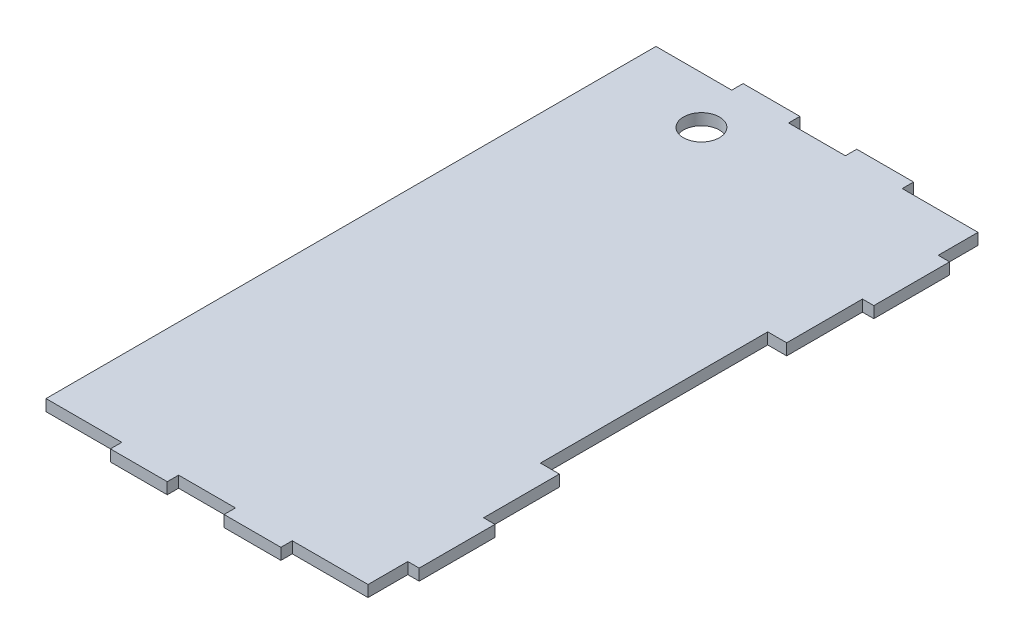
ISO-10303-21;
HEADER;
FILE_DESCRIPTION(('STEP AP214'),'2;1');
FILE_NAME('part.step','',(''),(''),'','','');
FILE_SCHEMA(('AUTOMOTIVE_DESIGN { 1 0 10303 214 1 1 1 1 }'));
ENDSEC;
DATA;
#1=APPLICATION_CONTEXT('core data for automotive mechanical design processes');
#2=APPLICATION_PROTOCOL_DEFINITION('international standard','automotive_design',2000,#1);
#3=PRODUCT_CONTEXT('',#1,'mechanical');
#4=PRODUCT('Part','Part','',(#3));
#5=PRODUCT_RELATED_PRODUCT_CATEGORY('part','',(#4));
#6=PRODUCT_DEFINITION_FORMATION('','',#4);
#7=PRODUCT_DEFINITION_CONTEXT('part definition',#1,'design');
#8=PRODUCT_DEFINITION('design','',#6,#7);
#9=PRODUCT_DEFINITION_SHAPE('','',#8);
#10=(LENGTH_UNIT() NAMED_UNIT(*) SI_UNIT(.MILLI.,.METRE.));
#11=(NAMED_UNIT(*) PLANE_ANGLE_UNIT() SI_UNIT($,.RADIAN.));
#12=(NAMED_UNIT(*) SI_UNIT($,.STERADIAN.) SOLID_ANGLE_UNIT());
#13=UNCERTAINTY_MEASURE_WITH_UNIT(LENGTH_MEASURE(1.E-05),#10,'distance_accuracy_value','');
#14=(GEOMETRIC_REPRESENTATION_CONTEXT(3) GLOBAL_UNCERTAINTY_ASSIGNED_CONTEXT((#13)) GLOBAL_UNIT_ASSIGNED_CONTEXT((#10,
#11,#12)) REPRESENTATION_CONTEXT('',''));
#15=CARTESIAN_POINT('',(0.,0.,0.));
#16=DIRECTION('',(0.,0.,1.));
#17=DIRECTION('',(1.,0.,0.));
#18=AXIS2_PLACEMENT_3D('',#15,#16,#17);
#19=CARTESIAN_POINT('',(0.,3.,-53.));
#20=DIRECTION('',(0.,0.,-1.));
#21=DIRECTION('',(-1.,0.,0.));
#22=AXIS2_PLACEMENT_3D('',#19,#20,#21);
#23=PLANE('',#22);
#24=DIRECTION('',(1.,0.,0.));
#25=VECTOR('',#24,1.);
#26=CARTESIAN_POINT('',(0.,0.,-53.));
#27=LINE('',#26,#25);
#28=CARTESIAN_POINT('',(85.5,0.,-53.));
#29=VERTEX_POINT('',#28);
#30=CARTESIAN_POINT('',(90.5,0.,-53.));
#31=VERTEX_POINT('',#30);
#32=EDGE_CURVE('E276',#29,#31,#27,.T.);
#33=ORIENTED_EDGE('',*,*,#32,.F.);
#34=DIRECTION('',(0.,-1.,0.));
#35=VECTOR('',#34,1.);
#36=CARTESIAN_POINT('',(85.5,3.,-53.));
#37=LINE('',#36,#35);
#38=CARTESIAN_POINT('',(85.5,3.,-53.));
#39=VERTEX_POINT('',#38);
#40=EDGE_CURVE('E11',#39,#29,#37,.T.);
#41=ORIENTED_EDGE('',*,*,#40,.F.);
#42=DIRECTION('',(1.,0.,0.));
#43=VECTOR('',#42,1.);
#44=CARTESIAN_POINT('',(0.,3.,-53.));
#45=LINE('',#44,#43);
#46=CARTESIAN_POINT('',(90.5,3.,-53.));
#47=VERTEX_POINT('',#46);
#48=EDGE_CURVE('E462',#39,#47,#45,.T.);
#49=ORIENTED_EDGE('',*,*,#48,.T.);
#50=DIRECTION('',(0.,-1.,0.));
#51=VECTOR('',#50,1.);
#52=CARTESIAN_POINT('',(90.5,3.,-53.));
#53=LINE('',#52,#51);
#54=EDGE_CURVE('E52',#47,#31,#53,.T.);
#55=ORIENTED_EDGE('',*,*,#54,.T.);
#56=EDGE_LOOP('',(#33,#41,#49,#55));
#57=FACE_BOUND('',#56,.T.);
#58=ADVANCED_FACE('F35',(#57),#23,.T.);
#59=CARTESIAN_POINT('',(85.5,3.,0.));
#60=DIRECTION('',(1.,0.,0.));
#61=DIRECTION('',(0.,0.,-1.));
#62=AXIS2_PLACEMENT_3D('',#59,#60,#61);
#63=PLANE('',#62);
#64=DIRECTION('',(0.,0.,1.));
#65=VECTOR('',#64,1.);
#66=CARTESIAN_POINT('',(85.5,0.,0.));
#67=LINE('',#66,#65);
#68=CARTESIAN_POINT('',(85.5,0.,-113.));
#69=VERTEX_POINT('',#68);
#70=EDGE_CURVE('E278',#69,#29,#67,.T.);
#71=ORIENTED_EDGE('',*,*,#70,.F.);
#72=DIRECTION('',(0.,-1.,0.));
#73=VECTOR('',#72,1.);
#74=CARTESIAN_POINT('',(85.5,3.,-113.));
#75=LINE('',#74,#73);
#76=CARTESIAN_POINT('',(85.5,3.,-113.));
#77=VERTEX_POINT('',#76);
#78=EDGE_CURVE('E44',#77,#69,#75,.T.);
#79=ORIENTED_EDGE('',*,*,#78,.F.);
#80=DIRECTION('',(0.,0.,1.));
#81=VECTOR('',#80,1.);
#82=CARTESIAN_POINT('',(85.5,3.,0.));
#83=LINE('',#82,#81);
#84=EDGE_CURVE('E460',#77,#39,#83,.T.);
#85=ORIENTED_EDGE('',*,*,#84,.T.);
#86=ORIENTED_EDGE('',*,*,#40,.T.);
#87=EDGE_LOOP('',(#71,#79,#85,#86));
#88=FACE_BOUND('',#87,.T.);
#89=ADVANCED_FACE('F447',(#88),#63,.T.);
#90=CARTESIAN_POINT('',(0.,3.,-113.));
#91=DIRECTION('',(0.,0.,1.));
#92=DIRECTION('',(1.,0.,0.));
#93=AXIS2_PLACEMENT_3D('',#90,#91,#92);
#94=PLANE('',#93);
#95=DIRECTION('',(-1.,0.,0.));
#96=VECTOR('',#95,1.);
#97=CARTESIAN_POINT('',(0.,0.,-113.));
#98=LINE('',#97,#96);
#99=CARTESIAN_POINT('',(90.5,0.,-113.));
#100=VERTEX_POINT('',#99);
#101=EDGE_CURVE('E281',#100,#69,#98,.T.);
#102=ORIENTED_EDGE('',*,*,#101,.F.);
#103=DIRECTION('',(0.,-1.,0.));
#104=VECTOR('',#103,1.);
#105=CARTESIAN_POINT('',(90.5,3.,-113.));
#106=LINE('',#105,#104);
#107=CARTESIAN_POINT('',(90.5,3.,-113.));
#108=VERTEX_POINT('',#107);
#109=EDGE_CURVE('E436',#108,#100,#106,.T.);
#110=ORIENTED_EDGE('',*,*,#109,.F.);
#111=DIRECTION('',(-1.,0.,0.));
#112=VECTOR('',#111,1.);
#113=CARTESIAN_POINT('',(0.,3.,-113.));
#114=LINE('',#113,#112);
#115=EDGE_CURVE('E443',#108,#77,#114,.T.);
#116=ORIENTED_EDGE('',*,*,#115,.T.);
#117=ORIENTED_EDGE('',*,*,#78,.T.);
#118=EDGE_LOOP('',(#102,#110,#116,#117));
#119=FACE_BOUND('',#118,.T.);
#120=ADVANCED_FACE('F441',(#119),#94,.T.);
#121=CARTESIAN_POINT('',(90.5,3.,0.));
#122=DIRECTION('',(-1.,0.,0.));
#123=DIRECTION('',(0.,0.,1.));
#124=AXIS2_PLACEMENT_3D('',#121,#122,#123);
#125=PLANE('',#124);
#126=DIRECTION('',(0.,0.,-1.));
#127=VECTOR('',#126,1.);
#128=CARTESIAN_POINT('',(90.5,0.,0.));
#129=LINE('',#128,#127);
#130=CARTESIAN_POINT('',(90.5,0.,-133.));
#131=VERTEX_POINT('',#130);
#132=EDGE_CURVE('E284',#100,#131,#129,.T.);
#133=ORIENTED_EDGE('',*,*,#132,.T.);
#134=DIRECTION('',(0.,-1.,0.));
#135=VECTOR('',#134,1.);
#136=CARTESIAN_POINT('',(90.5,3.,-133.));
#137=LINE('',#136,#135);
#138=CARTESIAN_POINT('',(90.5,3.,-133.));
#139=VERTEX_POINT('',#138);
#140=EDGE_CURVE('E433',#139,#131,#137,.T.);
#141=ORIENTED_EDGE('',*,*,#140,.F.);
#142=DIRECTION('',(0.,0.,-1.));
#143=VECTOR('',#142,1.);
#144=CARTESIAN_POINT('',(90.5,3.,0.));
#145=LINE('',#144,#143);
#146=EDGE_CURVE('E456',#108,#139,#145,.T.);
#147=ORIENTED_EDGE('',*,*,#146,.F.);
#148=ORIENTED_EDGE('',*,*,#109,.T.);
#149=EDGE_LOOP('',(#133,#141,#147,#148));
#150=FACE_BOUND('',#149,.T.);
#151=ADVANCED_FACE('F453',(#150),#125,.F.);
#152=CARTESIAN_POINT('',(0.,3.,-133.));
#153=DIRECTION('',(0.,0.,-1.));
#154=DIRECTION('',(-1.,0.,0.));
#155=AXIS2_PLACEMENT_3D('',#152,#153,#154);
#156=PLANE('',#155);
#157=DIRECTION('',(1.,0.,0.));
#158=VECTOR('',#157,1.);
#159=CARTESIAN_POINT('',(0.,0.,-133.));
#160=LINE('',#159,#158);
#161=CARTESIAN_POINT('',(93.5,0.,-133.));
#162=VERTEX_POINT('',#161);
#163=EDGE_CURVE('E287',#131,#162,#160,.T.);
#164=ORIENTED_EDGE('',*,*,#163,.T.);
#165=DIRECTION('',(0.,-1.,0.));
#166=VECTOR('',#165,1.);
#167=CARTESIAN_POINT('',(93.5,3.,-133.));
#168=LINE('',#167,#166);
#169=CARTESIAN_POINT('',(93.5,3.,-133.));
#170=VERTEX_POINT('',#169);
#171=EDGE_CURVE('E430',#170,#162,#168,.T.);
#172=ORIENTED_EDGE('',*,*,#171,.F.);
#173=DIRECTION('',(1.,0.,0.));
#174=VECTOR('',#173,1.);
#175=CARTESIAN_POINT('',(0.,3.,-133.));
#176=LINE('',#175,#174);
#177=EDGE_CURVE('E458',#139,#170,#176,.T.);
#178=ORIENTED_EDGE('',*,*,#177,.F.);
#179=ORIENTED_EDGE('',*,*,#140,.T.);
#180=EDGE_LOOP('',(#164,#172,#178,#179));
#181=FACE_BOUND('',#180,.T.);
#182=ADVANCED_FACE('F557',(#181),#156,.F.);
#183=CARTESIAN_POINT('',(93.5,3.,0.));
#184=DIRECTION('',(-1.,0.,0.));
#185=DIRECTION('',(0.,0.,1.));
#186=AXIS2_PLACEMENT_3D('',#183,#184,#185);
#187=PLANE('',#186);
#188=DIRECTION('',(0.,0.,-1.));
#189=VECTOR('',#188,1.);
#190=CARTESIAN_POINT('',(93.5,0.,0.));
#191=LINE('',#190,#189);
#192=CARTESIAN_POINT('',(93.5,0.,-153.));
#193=VERTEX_POINT('',#192);
#194=EDGE_CURVE('E290',#162,#193,#191,.T.);
#195=ORIENTED_EDGE('',*,*,#194,.T.);
#196=DIRECTION('',(0.,-1.,0.));
#197=VECTOR('',#196,1.);
#198=CARTESIAN_POINT('',(93.5,3.,-153.));
#199=LINE('',#198,#197);
#200=CARTESIAN_POINT('',(93.5,3.,-153.));
#201=VERTEX_POINT('',#200);
#202=EDGE_CURVE('E427',#201,#193,#199,.T.);
#203=ORIENTED_EDGE('',*,*,#202,.F.);
#204=DIRECTION('',(0.,0.,-1.));
#205=VECTOR('',#204,1.);
#206=CARTESIAN_POINT('',(93.5,3.,0.));
#207=LINE('',#206,#205);
#208=EDGE_CURVE('E467',#170,#201,#207,.T.);
#209=ORIENTED_EDGE('',*,*,#208,.F.);
#210=ORIENTED_EDGE('',*,*,#171,.T.);
#211=EDGE_LOOP('',(#195,#203,#209,#210));
#212=FACE_BOUND('',#211,.T.);
#213=ADVANCED_FACE('F560',(#212),#187,.F.);
#214=CARTESIAN_POINT('',(0.,3.,-153.));
#215=DIRECTION('',(0.,0.,1.));
#216=DIRECTION('',(1.,0.,0.));
#217=AXIS2_PLACEMENT_3D('',#214,#215,#216);
#218=PLANE('',#217);
#219=DIRECTION('',(-1.,0.,0.));
#220=VECTOR('',#219,1.);
#221=CARTESIAN_POINT('',(0.,0.,-153.));
#222=LINE('',#221,#220);
#223=CARTESIAN_POINT('',(90.5,0.,-153.));
#224=VERTEX_POINT('',#223);
#225=EDGE_CURVE('E293',#193,#224,#222,.T.);
#226=ORIENTED_EDGE('',*,*,#225,.T.);
#227=DIRECTION('',(0.,-1.,0.));
#228=VECTOR('',#227,1.);
#229=CARTESIAN_POINT('',(90.5,3.,-153.));
#230=LINE('',#229,#228);
#231=CARTESIAN_POINT('',(90.5,3.,-153.));
#232=VERTEX_POINT('',#231);
#233=EDGE_CURVE('E424',#232,#224,#230,.T.);
#234=ORIENTED_EDGE('',*,*,#233,.F.);
#235=DIRECTION('',(-1.,0.,0.));
#236=VECTOR('',#235,1.);
#237=CARTESIAN_POINT('',(0.,3.,-153.));
#238=LINE('',#237,#236);
#239=EDGE_CURVE('E470',#201,#232,#238,.T.);
#240=ORIENTED_EDGE('',*,*,#239,.F.);
#241=ORIENTED_EDGE('',*,*,#202,.T.);
#242=EDGE_LOOP('',(#226,#234,#240,#241));
#243=FACE_BOUND('',#242,.T.);
#244=ADVANCED_FACE('F564',(#243),#218,.F.);
#245=CARTESIAN_POINT('',(90.4999999999996,3.,2.39226627925182E-13));
#246=DIRECTION('',(-1.,0.,0.));
#247=DIRECTION('',(0.,0.,1.));
#248=AXIS2_PLACEMENT_3D('',#245,#246,#247);
#249=PLANE('',#248);
#250=DIRECTION('',(0.,0.,-1.));
#251=VECTOR('',#250,1.);
#252=CARTESIAN_POINT('',(90.4999999999996,0.,2.39226627925182E-13));
#253=LINE('',#252,#251);
#254=CARTESIAN_POINT('',(90.5,0.,-163.5));
#255=VERTEX_POINT('',#254);
#256=EDGE_CURVE('E296',#224,#255,#253,.T.);
#257=ORIENTED_EDGE('',*,*,#256,.T.);
#258=DIRECTION('',(0.,-1.,0.));
#259=VECTOR('',#258,1.);
#260=CARTESIAN_POINT('',(90.5,3.,-163.5));
#261=LINE('',#260,#259);
#262=CARTESIAN_POINT('',(90.5,3.,-163.5));
#263=VERTEX_POINT('',#262);
#264=EDGE_CURVE('E421',#263,#255,#261,.T.);
#265=ORIENTED_EDGE('',*,*,#264,.F.);
#266=DIRECTION('',(0.,0.,-1.));
#267=VECTOR('',#266,1.);
#268=CARTESIAN_POINT('',(90.4999999999996,3.,2.39226627925182E-13));
#269=LINE('',#268,#267);
#270=EDGE_CURVE('E473',#232,#263,#269,.T.);
#271=ORIENTED_EDGE('',*,*,#270,.F.);
#272=ORIENTED_EDGE('',*,*,#233,.T.);
#273=EDGE_LOOP('',(#257,#265,#271,#272));
#274=FACE_BOUND('',#273,.T.);
#275=ADVANCED_FACE('F568',(#274),#249,.F.);
#276=CARTESIAN_POINT('',(0.,3.,-163.5));
#277=DIRECTION('',(0.,0.,1.));
#278=DIRECTION('',(1.,0.,0.));
#279=AXIS2_PLACEMENT_3D('',#276,#277,#278);
#280=PLANE('',#279);
#281=DIRECTION('',(-1.,0.,0.));
#282=VECTOR('',#281,1.);
#283=CARTESIAN_POINT('',(0.,0.,-163.5));
#284=LINE('',#283,#282);
#285=CARTESIAN_POINT('',(70.5,0.,-163.5));
#286=VERTEX_POINT('',#285);
#287=EDGE_CURVE('E299',#255,#286,#284,.T.);
#288=ORIENTED_EDGE('',*,*,#287,.T.);
#289=DIRECTION('',(0.,-1.,0.));
#290=VECTOR('',#289,1.);
#291=CARTESIAN_POINT('',(70.5,3.,-163.5));
#292=LINE('',#291,#290);
#293=CARTESIAN_POINT('',(70.5,3.,-163.5));
#294=VERTEX_POINT('',#293);
#295=EDGE_CURVE('E419',#294,#286,#292,.T.);
#296=ORIENTED_EDGE('',*,*,#295,.F.);
#297=DIRECTION('',(-1.,0.,0.));
#298=VECTOR('',#297,1.);
#299=CARTESIAN_POINT('',(0.,3.,-163.5));
#300=LINE('',#299,#298);
#301=EDGE_CURVE('E476',#263,#294,#300,.T.);
#302=ORIENTED_EDGE('',*,*,#301,.F.);
#303=ORIENTED_EDGE('',*,*,#264,.T.);
#304=EDGE_LOOP('',(#288,#296,#302,#303));
#305=FACE_BOUND('',#304,.T.);
#306=ADVANCED_FACE('F572',(#305),#280,.F.);
#307=CARTESIAN_POINT('',(70.5,3.,0.));
#308=DIRECTION('',(1.,0.,0.));
#309=DIRECTION('',(0.,0.,-1.));
#310=AXIS2_PLACEMENT_3D('',#307,#308,#309);
#311=PLANE('',#310);
#312=DIRECTION('',(0.,0.,1.));
#313=VECTOR('',#312,1.);
#314=CARTESIAN_POINT('',(70.5,0.,0.));
#315=LINE('',#314,#313);
#316=CARTESIAN_POINT('',(70.5,0.,-166.5));
#317=VERTEX_POINT('',#316);
#318=EDGE_CURVE('E302',#317,#286,#315,.T.);
#319=ORIENTED_EDGE('',*,*,#318,.F.);
#320=DIRECTION('',(0.,-1.,0.));
#321=VECTOR('',#320,1.);
#322=CARTESIAN_POINT('',(70.5,3.,-166.5));
#323=LINE('',#322,#321);
#324=CARTESIAN_POINT('',(70.5,3.,-166.5));
#325=VERTEX_POINT('',#324);
#326=EDGE_CURVE('E417',#325,#317,#323,.T.);
#327=ORIENTED_EDGE('',*,*,#326,.F.);
#328=DIRECTION('',(0.,0.,1.));
#329=VECTOR('',#328,1.);
#330=CARTESIAN_POINT('',(70.5,3.,0.));
#331=LINE('',#330,#329);
#332=EDGE_CURVE('E478',#325,#294,#331,.T.);
#333=ORIENTED_EDGE('',*,*,#332,.T.);
#334=ORIENTED_EDGE('',*,*,#295,.T.);
#335=EDGE_LOOP('',(#319,#327,#333,#334));
#336=FACE_BOUND('',#335,.T.);
#337=ADVANCED_FACE('F576',(#336),#311,.T.);
#338=CARTESIAN_POINT('',(0.,3.,-166.5));
#339=DIRECTION('',(0.,0.,-1.));
#340=DIRECTION('',(-1.,0.,0.));
#341=AXIS2_PLACEMENT_3D('',#338,#339,#340);
#342=PLANE('',#341);
#343=DIRECTION('',(1.,0.,0.));
#344=VECTOR('',#343,1.);
#345=CARTESIAN_POINT('',(0.,0.,-166.5));
#346=LINE('',#345,#344);
#347=CARTESIAN_POINT('',(55.5,0.,-166.5));
#348=VERTEX_POINT('',#347);
#349=EDGE_CURVE('E305',#348,#317,#346,.T.);
#350=ORIENTED_EDGE('',*,*,#349,.F.);
#351=DIRECTION('',(0.,-1.,0.));
#352=VECTOR('',#351,1.);
#353=CARTESIAN_POINT('',(55.5,3.,-166.5));
#354=LINE('',#353,#352);
#355=CARTESIAN_POINT('',(55.5,3.,-166.5));
#356=VERTEX_POINT('',#355);
#357=EDGE_CURVE('E415',#356,#348,#354,.T.);
#358=ORIENTED_EDGE('',*,*,#357,.F.);
#359=DIRECTION('',(1.,0.,0.));
#360=VECTOR('',#359,1.);
#361=CARTESIAN_POINT('',(0.,3.,-166.5));
#362=LINE('',#361,#360);
#363=EDGE_CURVE('E481',#356,#325,#362,.T.);
#364=ORIENTED_EDGE('',*,*,#363,.T.);
#365=ORIENTED_EDGE('',*,*,#326,.T.);
#366=EDGE_LOOP('',(#350,#358,#364,#365));
#367=FACE_BOUND('',#366,.T.);
#368=ADVANCED_FACE('F580',(#367),#342,.T.);
#369=CARTESIAN_POINT('',(55.5,3.,0.));
#370=DIRECTION('',(-1.,0.,0.));
#371=DIRECTION('',(0.,0.,1.));
#372=AXIS2_PLACEMENT_3D('',#369,#370,#371);
#373=PLANE('',#372);
#374=DIRECTION('',(0.,0.,-1.));
#375=VECTOR('',#374,1.);
#376=CARTESIAN_POINT('',(55.5,0.,0.));
#377=LINE('',#376,#375);
#378=CARTESIAN_POINT('',(55.5,0.,-163.5));
#379=VERTEX_POINT('',#378);
#380=EDGE_CURVE('E308',#379,#348,#377,.T.);
#381=ORIENTED_EDGE('',*,*,#380,.F.);
#382=DIRECTION('',(0.,-1.,0.));
#383=VECTOR('',#382,1.);
#384=CARTESIAN_POINT('',(55.5,3.,-163.5));
#385=LINE('',#384,#383);
#386=CARTESIAN_POINT('',(55.5,3.,-163.5));
#387=VERTEX_POINT('',#386);
#388=EDGE_CURVE('E413',#387,#379,#385,.T.);
#389=ORIENTED_EDGE('',*,*,#388,.F.);
#390=DIRECTION('',(0.,0.,-1.));
#391=VECTOR('',#390,1.);
#392=CARTESIAN_POINT('',(55.5,3.,0.));
#393=LINE('',#392,#391);
#394=EDGE_CURVE('E484',#387,#356,#393,.T.);
#395=ORIENTED_EDGE('',*,*,#394,.T.);
#396=ORIENTED_EDGE('',*,*,#357,.T.);
#397=EDGE_LOOP('',(#381,#389,#395,#396));
#398=FACE_BOUND('',#397,.T.);
#399=ADVANCED_FACE('F584',(#398),#373,.T.);
#400=CARTESIAN_POINT('',(3.02535774210355E-13,3.,-163.5));
#401=DIRECTION('',(0.,0.,1.));
#402=DIRECTION('',(1.,0.,0.));
#403=AXIS2_PLACEMENT_3D('',#400,#401,#402);
#404=PLANE('',#403);
#405=DIRECTION('',(-1.,0.,0.));
#406=VECTOR('',#405,1.);
#407=CARTESIAN_POINT('',(3.02535774210355E-13,0.,-163.5));
#408=LINE('',#407,#406);
#409=CARTESIAN_POINT('',(40.5,0.,-163.5));
#410=VERTEX_POINT('',#409);
#411=EDGE_CURVE('E311',#379,#410,#408,.T.);
#412=ORIENTED_EDGE('',*,*,#411,.T.);
#413=DIRECTION('',(0.,-1.,0.));
#414=VECTOR('',#413,1.);
#415=CARTESIAN_POINT('',(40.5,3.,-163.5));
#416=LINE('',#415,#414);
#417=CARTESIAN_POINT('',(40.5,3.,-163.5));
#418=VERTEX_POINT('',#417);
#419=EDGE_CURVE('E410',#418,#410,#416,.T.);
#420=ORIENTED_EDGE('',*,*,#419,.F.);
#421=DIRECTION('',(-1.,0.,0.));
#422=VECTOR('',#421,1.);
#423=CARTESIAN_POINT('',(3.02535774210355E-13,3.,-163.5));
#424=LINE('',#423,#422);
#425=EDGE_CURVE('E487',#387,#418,#424,.T.);
#426=ORIENTED_EDGE('',*,*,#425,.F.);
#427=ORIENTED_EDGE('',*,*,#388,.T.);
#428=EDGE_LOOP('',(#412,#420,#426,#427));
#429=FACE_BOUND('',#428,.T.);
#430=ADVANCED_FACE('F588',(#429),#404,.F.);
#431=CARTESIAN_POINT('',(40.5,3.,0.));
#432=DIRECTION('',(-1.,0.,0.));
#433=DIRECTION('',(0.,0.,1.));
#434=AXIS2_PLACEMENT_3D('',#431,#432,#433);
#435=PLANE('',#434);
#436=DIRECTION('',(0.,0.,-1.));
#437=VECTOR('',#436,1.);
#438=CARTESIAN_POINT('',(40.5,0.,0.));
#439=LINE('',#438,#437);
#440=CARTESIAN_POINT('',(40.5,0.,-166.5));
#441=VERTEX_POINT('',#440);
#442=EDGE_CURVE('E314',#410,#441,#439,.T.);
#443=ORIENTED_EDGE('',*,*,#442,.T.);
#444=DIRECTION('',(0.,-1.,0.));
#445=VECTOR('',#444,1.);
#446=CARTESIAN_POINT('',(40.5,3.,-166.5));
#447=LINE('',#446,#445);
#448=CARTESIAN_POINT('',(40.5,3.,-166.5));
#449=VERTEX_POINT('',#448);
#450=EDGE_CURVE('E407',#449,#441,#447,.T.);
#451=ORIENTED_EDGE('',*,*,#450,.F.);
#452=DIRECTION('',(0.,0.,-1.));
#453=VECTOR('',#452,1.);
#454=CARTESIAN_POINT('',(40.5,3.,0.));
#455=LINE('',#454,#453);
#456=EDGE_CURVE('E490',#418,#449,#455,.T.);
#457=ORIENTED_EDGE('',*,*,#456,.F.);
#458=ORIENTED_EDGE('',*,*,#419,.T.);
#459=EDGE_LOOP('',(#443,#451,#457,#458));
#460=FACE_BOUND('',#459,.T.);
#461=ADVANCED_FACE('F592',(#460),#435,.F.);
#462=CARTESIAN_POINT('',(0.,3.,-166.5));
#463=DIRECTION('',(0.,0.,1.));
#464=DIRECTION('',(1.,0.,0.));
#465=AXIS2_PLACEMENT_3D('',#462,#463,#464);
#466=PLANE('',#465);
#467=DIRECTION('',(-1.,0.,0.));
#468=VECTOR('',#467,1.);
#469=CARTESIAN_POINT('',(0.,0.,-166.5));
#470=LINE('',#469,#468);
#471=CARTESIAN_POINT('',(25.5,0.,-166.5));
#472=VERTEX_POINT('',#471);
#473=EDGE_CURVE('E317',#441,#472,#470,.T.);
#474=ORIENTED_EDGE('',*,*,#473,.T.);
#475=DIRECTION('',(0.,-1.,0.));
#476=VECTOR('',#475,1.);
#477=CARTESIAN_POINT('',(25.5,3.,-166.5));
#478=LINE('',#477,#476);
#479=CARTESIAN_POINT('',(25.5,3.,-166.5));
#480=VERTEX_POINT('',#479);
#481=EDGE_CURVE('E404',#480,#472,#478,.T.);
#482=ORIENTED_EDGE('',*,*,#481,.F.);
#483=DIRECTION('',(-1.,0.,0.));
#484=VECTOR('',#483,1.);
#485=CARTESIAN_POINT('',(0.,3.,-166.5));
#486=LINE('',#485,#484);
#487=EDGE_CURVE('E493',#449,#480,#486,.T.);
#488=ORIENTED_EDGE('',*,*,#487,.F.);
#489=ORIENTED_EDGE('',*,*,#450,.T.);
#490=EDGE_LOOP('',(#474,#482,#488,#489));
#491=FACE_BOUND('',#490,.T.);
#492=ADVANCED_FACE('F596',(#491),#466,.F.);
#493=CARTESIAN_POINT('',(25.5,3.,0.));
#494=DIRECTION('',(1.,0.,0.));
#495=DIRECTION('',(0.,0.,-1.));
#496=AXIS2_PLACEMENT_3D('',#493,#494,#495);
#497=PLANE('',#496);
#498=DIRECTION('',(0.,0.,1.));
#499=VECTOR('',#498,1.);
#500=CARTESIAN_POINT('',(25.5,0.,0.));
#501=LINE('',#500,#499);
#502=CARTESIAN_POINT('',(25.5,0.,-163.5));
#503=VERTEX_POINT('',#502);
#504=EDGE_CURVE('E320',#472,#503,#501,.T.);
#505=ORIENTED_EDGE('',*,*,#504,.T.);
#506=DIRECTION('',(0.,-1.,0.));
#507=VECTOR('',#506,1.);
#508=CARTESIAN_POINT('',(25.5,3.,-163.5));
#509=LINE('',#508,#507);
#510=CARTESIAN_POINT('',(25.5,3.,-163.5));
#511=VERTEX_POINT('',#510);
#512=EDGE_CURVE('E401',#511,#503,#509,.T.);
#513=ORIENTED_EDGE('',*,*,#512,.F.);
#514=DIRECTION('',(0.,0.,1.));
#515=VECTOR('',#514,1.);
#516=CARTESIAN_POINT('',(25.5,3.,0.));
#517=LINE('',#516,#515);
#518=EDGE_CURVE('E496',#480,#511,#517,.T.);
#519=ORIENTED_EDGE('',*,*,#518,.F.);
#520=ORIENTED_EDGE('',*,*,#481,.T.);
#521=EDGE_LOOP('',(#505,#513,#519,#520));
#522=FACE_BOUND('',#521,.T.);
#523=ADVANCED_FACE('F600',(#522),#497,.F.);
#524=CARTESIAN_POINT('',(2.26901830657766E-13,3.,-163.5));
#525=DIRECTION('',(0.,0.,1.));
#526=DIRECTION('',(1.,0.,0.));
#527=AXIS2_PLACEMENT_3D('',#524,#525,#526);
#528=PLANE('',#527);
#529=DIRECTION('',(-1.,0.,0.));
#530=VECTOR('',#529,1.);
#531=CARTESIAN_POINT('',(2.26901830657766E-13,0.,-163.5));
#532=LINE('',#531,#530);
#533=CARTESIAN_POINT('',(5.49999999999999,0.,-163.5));
#534=VERTEX_POINT('',#533);
#535=EDGE_CURVE('E323',#503,#534,#532,.T.);
#536=ORIENTED_EDGE('',*,*,#535,.T.);
#537=DIRECTION('',(0.,-1.,0.));
#538=VECTOR('',#537,1.);
#539=CARTESIAN_POINT('',(5.49999999999999,3.,-163.5));
#540=LINE('',#539,#538);
#541=CARTESIAN_POINT('',(5.49999999999999,3.,-163.5));
#542=VERTEX_POINT('',#541);
#543=EDGE_CURVE('E398',#542,#534,#540,.T.);
#544=ORIENTED_EDGE('',*,*,#543,.F.);
#545=DIRECTION('',(-1.,0.,0.));
#546=VECTOR('',#545,1.);
#547=CARTESIAN_POINT('',(2.26901830657766E-13,3.,-163.5));
#548=LINE('',#547,#546);
#549=EDGE_CURVE('E499',#511,#542,#548,.T.);
#550=ORIENTED_EDGE('',*,*,#549,.F.);
#551=ORIENTED_EDGE('',*,*,#512,.T.);
#552=EDGE_LOOP('',(#536,#544,#550,#551));
#553=FACE_BOUND('',#552,.T.);
#554=ADVANCED_FACE('F604',(#553),#528,.F.);
#555=CARTESIAN_POINT('',(5.50000000000001,3.,0.));
#556=DIRECTION('',(1.,0.,0.));
#557=DIRECTION('',(0.,0.,-1.));
#558=AXIS2_PLACEMENT_3D('',#555,#556,#557);
#559=PLANE('',#558);
#560=DIRECTION('',(0.,0.,1.));
#561=VECTOR('',#560,1.);
#562=CARTESIAN_POINT('',(5.50000000000001,0.,0.));
#563=LINE('',#562,#561);
#564=CARTESIAN_POINT('',(5.50000000000001,0.,-2.50000000000001));
#565=VERTEX_POINT('',#564);
#566=EDGE_CURVE('E326',#534,#565,#563,.T.);
#567=ORIENTED_EDGE('',*,*,#566,.T.);
#568=DIRECTION('',(0.,-1.,0.));
#569=VECTOR('',#568,1.);
#570=CARTESIAN_POINT('',(5.50000000000001,3.,-2.50000000000001));
#571=LINE('',#570,#569);
#572=CARTESIAN_POINT('',(5.50000000000001,3.,-2.50000000000001));
#573=VERTEX_POINT('',#572);
#574=EDGE_CURVE('E396',#573,#565,#571,.T.);
#575=ORIENTED_EDGE('',*,*,#574,.F.);
#576=DIRECTION('',(0.,0.,1.));
#577=VECTOR('',#576,1.);
#578=CARTESIAN_POINT('',(5.50000000000001,3.,0.));
#579=LINE('',#578,#577);
#580=EDGE_CURVE('E502',#542,#573,#579,.T.);
#581=ORIENTED_EDGE('',*,*,#580,.F.);
#582=ORIENTED_EDGE('',*,*,#543,.T.);
#583=EDGE_LOOP('',(#567,#575,#581,#582));
#584=FACE_BOUND('',#583,.T.);
#585=ADVANCED_FACE('F608',(#584),#559,.F.);
#586=CARTESIAN_POINT('',(0.,3.,-2.50000000000001));
#587=DIRECTION('',(0.,0.,1.));
#588=DIRECTION('',(1.,0.,0.));
#589=AXIS2_PLACEMENT_3D('',#586,#587,#588);
#590=PLANE('',#589);
#591=DIRECTION('',(-1.,0.,0.));
#592=VECTOR('',#591,1.);
#593=CARTESIAN_POINT('',(0.,0.,-2.50000000000001));
#594=LINE('',#593,#592);
#595=CARTESIAN_POINT('',(25.5,0.,-2.50000000000001));
#596=VERTEX_POINT('',#595);
#597=EDGE_CURVE('E329',#596,#565,#594,.T.);
#598=ORIENTED_EDGE('',*,*,#597,.F.);
#599=DIRECTION('',(0.,-1.,0.));
#600=VECTOR('',#599,1.);
#601=CARTESIAN_POINT('',(25.5,3.,-2.50000000000001));
#602=LINE('',#601,#600);
#603=CARTESIAN_POINT('',(25.5,3.,-2.50000000000001));
#604=VERTEX_POINT('',#603);
#605=EDGE_CURVE('E394',#604,#596,#602,.T.);
#606=ORIENTED_EDGE('',*,*,#605,.F.);
#607=DIRECTION('',(-1.,0.,0.));
#608=VECTOR('',#607,1.);
#609=CARTESIAN_POINT('',(0.,3.,-2.50000000000001));
#610=LINE('',#609,#608);
#611=EDGE_CURVE('E504',#604,#573,#610,.T.);
#612=ORIENTED_EDGE('',*,*,#611,.T.);
#613=ORIENTED_EDGE('',*,*,#574,.T.);
#614=EDGE_LOOP('',(#598,#606,#612,#613));
#615=FACE_BOUND('',#614,.T.);
#616=ADVANCED_FACE('F612',(#615),#590,.T.);
#617=CARTESIAN_POINT('',(25.5,3.,0.));
#618=DIRECTION('',(-1.,0.,0.));
#619=DIRECTION('',(0.,0.,1.));
#620=AXIS2_PLACEMENT_3D('',#617,#618,#619);
#621=PLANE('',#620);
#622=DIRECTION('',(0.,0.,-1.));
#623=VECTOR('',#622,1.);
#624=CARTESIAN_POINT('',(25.5,0.,0.));
#625=LINE('',#624,#623);
#626=CARTESIAN_POINT('',(25.5,0.,0.49999999999999));
#627=VERTEX_POINT('',#626);
#628=EDGE_CURVE('E332',#627,#596,#625,.T.);
#629=ORIENTED_EDGE('',*,*,#628,.F.);
#630=DIRECTION('',(0.,-1.,0.));
#631=VECTOR('',#630,1.);
#632=CARTESIAN_POINT('',(25.5,3.,0.49999999999999));
#633=LINE('',#632,#631);
#634=CARTESIAN_POINT('',(25.5,3.,0.49999999999999));
#635=VERTEX_POINT('',#634);
#636=EDGE_CURVE('E392',#635,#627,#633,.T.);
#637=ORIENTED_EDGE('',*,*,#636,.F.);
#638=DIRECTION('',(0.,0.,-1.));
#639=VECTOR('',#638,1.);
#640=CARTESIAN_POINT('',(25.5,3.,0.));
#641=LINE('',#640,#639);
#642=EDGE_CURVE('E507',#635,#604,#641,.T.);
#643=ORIENTED_EDGE('',*,*,#642,.T.);
#644=ORIENTED_EDGE('',*,*,#605,.T.);
#645=EDGE_LOOP('',(#629,#637,#643,#644));
#646=FACE_BOUND('',#645,.T.);
#647=ADVANCED_FACE('F616',(#646),#621,.T.);
#648=CARTESIAN_POINT('',(0.,3.,0.49999999999999));
#649=DIRECTION('',(0.,0.,-1.));
#650=DIRECTION('',(-1.,0.,0.));
#651=AXIS2_PLACEMENT_3D('',#648,#649,#650);
#652=PLANE('',#651);
#653=DIRECTION('',(1.,0.,0.));
#654=VECTOR('',#653,1.);
#655=CARTESIAN_POINT('',(0.,0.,0.49999999999999));
#656=LINE('',#655,#654);
#657=CARTESIAN_POINT('',(40.5,0.,0.49999999999999));
#658=VERTEX_POINT('',#657);
#659=EDGE_CURVE('E335',#627,#658,#656,.T.);
#660=ORIENTED_EDGE('',*,*,#659,.T.);
#661=DIRECTION('',(0.,-1.,0.));
#662=VECTOR('',#661,1.);
#663=CARTESIAN_POINT('',(40.5,3.,0.49999999999999));
#664=LINE('',#663,#662);
#665=CARTESIAN_POINT('',(40.5,3.,0.49999999999999));
#666=VERTEX_POINT('',#665);
#667=EDGE_CURVE('E390',#666,#658,#664,.T.);
#668=ORIENTED_EDGE('',*,*,#667,.F.);
#669=DIRECTION('',(1.,0.,0.));
#670=VECTOR('',#669,1.);
#671=CARTESIAN_POINT('',(0.,3.,0.49999999999999));
#672=LINE('',#671,#670);
#673=EDGE_CURVE('E510',#635,#666,#672,.T.);
#674=ORIENTED_EDGE('',*,*,#673,.F.);
#675=ORIENTED_EDGE('',*,*,#636,.T.);
#676=EDGE_LOOP('',(#660,#668,#674,#675));
#677=FACE_BOUND('',#676,.T.);
#678=ADVANCED_FACE('F620',(#677),#652,.F.);
#679=CARTESIAN_POINT('',(40.5,3.,0.));
#680=DIRECTION('',(1.,0.,0.));
#681=DIRECTION('',(0.,0.,-1.));
#682=AXIS2_PLACEMENT_3D('',#679,#680,#681);
#683=PLANE('',#682);
#684=DIRECTION('',(0.,0.,1.));
#685=VECTOR('',#684,1.);
#686=CARTESIAN_POINT('',(40.5,0.,0.));
#687=LINE('',#686,#685);
#688=CARTESIAN_POINT('',(40.5,0.,-2.50000000000001));
#689=VERTEX_POINT('',#688);
#690=EDGE_CURVE('E338',#689,#658,#687,.T.);
#691=ORIENTED_EDGE('',*,*,#690,.F.);
#692=DIRECTION('',(0.,-1.,0.));
#693=VECTOR('',#692,1.);
#694=CARTESIAN_POINT('',(40.5,3.,-2.50000000000001));
#695=LINE('',#694,#693);
#696=CARTESIAN_POINT('',(40.5,3.,-2.50000000000001));
#697=VERTEX_POINT('',#696);
#698=EDGE_CURVE('E388',#697,#689,#695,.T.);
#699=ORIENTED_EDGE('',*,*,#698,.F.);
#700=DIRECTION('',(0.,0.,1.));
#701=VECTOR('',#700,1.);
#702=CARTESIAN_POINT('',(40.5,3.,0.));
#703=LINE('',#702,#701);
#704=EDGE_CURVE('E512',#697,#666,#703,.T.);
#705=ORIENTED_EDGE('',*,*,#704,.T.);
#706=ORIENTED_EDGE('',*,*,#667,.T.);
#707=EDGE_LOOP('',(#691,#699,#705,#706));
#708=FACE_BOUND('',#707,.T.);
#709=ADVANCED_FACE('F624',(#708),#683,.T.);
#710=CARTESIAN_POINT('',(0.,3.,-2.5));
#711=DIRECTION('',(0.,0.,-1.));
#712=DIRECTION('',(-1.,0.,0.));
#713=AXIS2_PLACEMENT_3D('',#710,#711,#712);
#714=PLANE('',#713);
#715=DIRECTION('',(1.,0.,0.));
#716=VECTOR('',#715,1.);
#717=CARTESIAN_POINT('',(0.,0.,-2.5));
#718=LINE('',#717,#716);
#719=CARTESIAN_POINT('',(55.5,0.,-2.50000000000001));
#720=VERTEX_POINT('',#719);
#721=EDGE_CURVE('E341',#689,#720,#718,.T.);
#722=ORIENTED_EDGE('',*,*,#721,.T.);
#723=DIRECTION('',(0.,-1.,0.));
#724=VECTOR('',#723,1.);
#725=CARTESIAN_POINT('',(55.5,3.,-2.50000000000001));
#726=LINE('',#725,#724);
#727=CARTESIAN_POINT('',(55.5,3.,-2.50000000000001));
#728=VERTEX_POINT('',#727);
#729=EDGE_CURVE('E385',#728,#720,#726,.T.);
#730=ORIENTED_EDGE('',*,*,#729,.F.);
#731=DIRECTION('',(1.,0.,0.));
#732=VECTOR('',#731,1.);
#733=CARTESIAN_POINT('',(0.,3.,-2.5));
#734=LINE('',#733,#732);
#735=EDGE_CURVE('E515',#697,#728,#734,.T.);
#736=ORIENTED_EDGE('',*,*,#735,.F.);
#737=ORIENTED_EDGE('',*,*,#698,.T.);
#738=EDGE_LOOP('',(#722,#730,#736,#737));
#739=FACE_BOUND('',#738,.T.);
#740=ADVANCED_FACE('F628',(#739),#714,.F.);
#741=CARTESIAN_POINT('',(55.5,3.,0.));
#742=DIRECTION('',(1.,0.,0.));
#743=DIRECTION('',(0.,0.,-1.));
#744=AXIS2_PLACEMENT_3D('',#741,#742,#743);
#745=PLANE('',#744);
#746=DIRECTION('',(0.,0.,1.));
#747=VECTOR('',#746,1.);
#748=CARTESIAN_POINT('',(55.5,0.,0.));
#749=LINE('',#748,#747);
#750=CARTESIAN_POINT('',(55.5,0.,0.49999999999999));
#751=VERTEX_POINT('',#750);
#752=EDGE_CURVE('E344',#720,#751,#749,.T.);
#753=ORIENTED_EDGE('',*,*,#752,.T.);
#754=DIRECTION('',(0.,-1.,0.));
#755=VECTOR('',#754,1.);
#756=CARTESIAN_POINT('',(55.5,3.,0.49999999999999));
#757=LINE('',#756,#755);
#758=CARTESIAN_POINT('',(55.5,3.,0.49999999999999));
#759=VERTEX_POINT('',#758);
#760=EDGE_CURVE('E382',#759,#751,#757,.T.);
#761=ORIENTED_EDGE('',*,*,#760,.F.);
#762=DIRECTION('',(0.,0.,1.));
#763=VECTOR('',#762,1.);
#764=CARTESIAN_POINT('',(55.5,3.,0.));
#765=LINE('',#764,#763);
#766=EDGE_CURVE('E518',#728,#759,#765,.T.);
#767=ORIENTED_EDGE('',*,*,#766,.F.);
#768=ORIENTED_EDGE('',*,*,#729,.T.);
#769=EDGE_LOOP('',(#753,#761,#767,#768));
#770=FACE_BOUND('',#769,.T.);
#771=ADVANCED_FACE('F632',(#770),#745,.F.);
#772=CARTESIAN_POINT('',(0.,3.,0.49999999999999));
#773=DIRECTION('',(0.,0.,-1.));
#774=DIRECTION('',(-1.,0.,0.));
#775=AXIS2_PLACEMENT_3D('',#772,#773,#774);
#776=PLANE('',#775);
#777=DIRECTION('',(1.,0.,0.));
#778=VECTOR('',#777,1.);
#779=CARTESIAN_POINT('',(0.,0.,0.49999999999999));
#780=LINE('',#779,#778);
#781=CARTESIAN_POINT('',(70.5,0.,0.49999999999999));
#782=VERTEX_POINT('',#781);
#783=EDGE_CURVE('E347',#751,#782,#780,.T.);
#784=ORIENTED_EDGE('',*,*,#783,.T.);
#785=DIRECTION('',(0.,-1.,0.));
#786=VECTOR('',#785,1.);
#787=CARTESIAN_POINT('',(70.5,3.,0.49999999999999));
#788=LINE('',#787,#786);
#789=CARTESIAN_POINT('',(70.5,3.,0.49999999999999));
#790=VERTEX_POINT('',#789);
#791=EDGE_CURVE('E379',#790,#782,#788,.T.);
#792=ORIENTED_EDGE('',*,*,#791,.F.);
#793=DIRECTION('',(1.,0.,0.));
#794=VECTOR('',#793,1.);
#795=CARTESIAN_POINT('',(0.,3.,0.49999999999999));
#796=LINE('',#795,#794);
#797=EDGE_CURVE('E521',#759,#790,#796,.T.);
#798=ORIENTED_EDGE('',*,*,#797,.F.);
#799=ORIENTED_EDGE('',*,*,#760,.T.);
#800=EDGE_LOOP('',(#784,#792,#798,#799));
#801=FACE_BOUND('',#800,.T.);
#802=ADVANCED_FACE('F636',(#801),#776,.F.);
#803=CARTESIAN_POINT('',(70.5,3.,0.));
#804=DIRECTION('',(-1.,0.,0.));
#805=DIRECTION('',(0.,0.,1.));
#806=AXIS2_PLACEMENT_3D('',#803,#804,#805);
#807=PLANE('',#806);
#808=DIRECTION('',(0.,0.,-1.));
#809=VECTOR('',#808,1.);
#810=CARTESIAN_POINT('',(70.5,0.,0.));
#811=LINE('',#810,#809);
#812=CARTESIAN_POINT('',(70.5,0.,-2.5));
#813=VERTEX_POINT('',#812);
#814=EDGE_CURVE('E350',#782,#813,#811,.T.);
#815=ORIENTED_EDGE('',*,*,#814,.T.);
#816=DIRECTION('',(0.,-1.,0.));
#817=VECTOR('',#816,1.);
#818=CARTESIAN_POINT('',(70.5,3.,-2.5));
#819=LINE('',#818,#817);
#820=CARTESIAN_POINT('',(70.5,3.,-2.5));
#821=VERTEX_POINT('',#820);
#822=EDGE_CURVE('E376',#821,#813,#819,.T.);
#823=ORIENTED_EDGE('',*,*,#822,.F.);
#824=DIRECTION('',(0.,0.,-1.));
#825=VECTOR('',#824,1.);
#826=CARTESIAN_POINT('',(70.5,3.,0.));
#827=LINE('',#826,#825);
#828=EDGE_CURVE('E524',#790,#821,#827,.T.);
#829=ORIENTED_EDGE('',*,*,#828,.F.);
#830=ORIENTED_EDGE('',*,*,#791,.T.);
#831=EDGE_LOOP('',(#815,#823,#829,#830));
#832=FACE_BOUND('',#831,.T.);
#833=ADVANCED_FACE('F640',(#832),#807,.F.);
#834=CARTESIAN_POINT('',(0.,3.,-2.49999999999998));
#835=DIRECTION('',(0.,0.,-1.));
#836=DIRECTION('',(-1.,0.,0.));
#837=AXIS2_PLACEMENT_3D('',#834,#835,#836);
#838=PLANE('',#837);
#839=DIRECTION('',(1.,0.,0.));
#840=VECTOR('',#839,1.);
#841=CARTESIAN_POINT('',(0.,0.,-2.49999999999998));
#842=LINE('',#841,#840);
#843=CARTESIAN_POINT('',(90.5,0.,-2.50000000000001));
#844=VERTEX_POINT('',#843);
#845=EDGE_CURVE('E353',#813,#844,#842,.T.);
#846=ORIENTED_EDGE('',*,*,#845,.T.);
#847=DIRECTION('',(0.,-1.,0.));
#848=VECTOR('',#847,1.);
#849=CARTESIAN_POINT('',(90.5,3.,-2.50000000000001));
#850=LINE('',#849,#848);
#851=CARTESIAN_POINT('',(90.5,3.,-2.50000000000001));
#852=VERTEX_POINT('',#851);
#853=EDGE_CURVE('E374',#852,#844,#850,.T.);
#854=ORIENTED_EDGE('',*,*,#853,.F.);
#855=DIRECTION('',(1.,0.,0.));
#856=VECTOR('',#855,1.);
#857=CARTESIAN_POINT('',(0.,3.,-2.49999999999998));
#858=LINE('',#857,#856);
#859=EDGE_CURVE('E527',#821,#852,#858,.T.);
#860=ORIENTED_EDGE('',*,*,#859,.F.);
#861=ORIENTED_EDGE('',*,*,#822,.T.);
#862=EDGE_LOOP('',(#846,#854,#860,#861));
#863=FACE_BOUND('',#862,.T.);
#864=ADVANCED_FACE('F644',(#863),#838,.F.);
#865=CARTESIAN_POINT('',(90.5,3.,-2.39226627925183E-13));
#866=DIRECTION('',(1.,0.,0.));
#867=DIRECTION('',(0.,0.,-1.));
#868=AXIS2_PLACEMENT_3D('',#865,#866,#867);
#869=PLANE('',#868);
#870=DIRECTION('',(0.,0.,1.));
#871=VECTOR('',#870,1.);
#872=CARTESIAN_POINT('',(90.5,0.,-2.39226627925183E-13));
#873=LINE('',#872,#871);
#874=CARTESIAN_POINT('',(90.5,0.,-13.));
#875=VERTEX_POINT('',#874);
#876=EDGE_CURVE('E356',#875,#844,#873,.T.);
#877=ORIENTED_EDGE('',*,*,#876,.F.);
#878=DIRECTION('',(0.,-1.,0.));
#879=VECTOR('',#878,1.);
#880=CARTESIAN_POINT('',(90.5,3.,-13.));
#881=LINE('',#880,#879);
#882=CARTESIAN_POINT('',(90.5,3.,-13.));
#883=VERTEX_POINT('',#882);
#884=EDGE_CURVE('E372',#883,#875,#881,.T.);
#885=ORIENTED_EDGE('',*,*,#884,.F.);
#886=DIRECTION('',(0.,0.,1.));
#887=VECTOR('',#886,1.);
#888=CARTESIAN_POINT('',(90.5,3.,-2.39226627925183E-13));
#889=LINE('',#888,#887);
#890=EDGE_CURVE('E529',#883,#852,#889,.T.);
#891=ORIENTED_EDGE('',*,*,#890,.T.);
#892=ORIENTED_EDGE('',*,*,#853,.T.);
#893=EDGE_LOOP('',(#877,#885,#891,#892));
#894=FACE_BOUND('',#893,.T.);
#895=ADVANCED_FACE('F648',(#894),#869,.T.);
#896=CARTESIAN_POINT('',(0.,3.,-13.));
#897=DIRECTION('',(0.,0.,1.));
#898=DIRECTION('',(1.,0.,0.));
#899=AXIS2_PLACEMENT_3D('',#896,#897,#898);
#900=PLANE('',#899);
#901=DIRECTION('',(-1.,0.,0.));
#902=VECTOR('',#901,1.);
#903=CARTESIAN_POINT('',(0.,0.,-13.));
#904=LINE('',#903,#902);
#905=CARTESIAN_POINT('',(93.5,0.,-13.));
#906=VERTEX_POINT('',#905);
#907=EDGE_CURVE('E359',#906,#875,#904,.T.);
#908=ORIENTED_EDGE('',*,*,#907,.F.);
#909=DIRECTION('',(0.,-1.,0.));
#910=VECTOR('',#909,1.);
#911=CARTESIAN_POINT('',(93.5,3.,-13.));
#912=LINE('',#911,#910);
#913=CARTESIAN_POINT('',(93.5,3.,-13.));
#914=VERTEX_POINT('',#913);
#915=EDGE_CURVE('E265',#914,#906,#912,.T.);
#916=ORIENTED_EDGE('',*,*,#915,.F.);
#917=DIRECTION('',(-1.,0.,0.));
#918=VECTOR('',#917,1.);
#919=CARTESIAN_POINT('',(0.,3.,-13.));
#920=LINE('',#919,#918);
#921=EDGE_CURVE('E255',#914,#883,#920,.T.);
#922=ORIENTED_EDGE('',*,*,#921,.T.);
#923=ORIENTED_EDGE('',*,*,#884,.T.);
#924=EDGE_LOOP('',(#908,#916,#922,#923));
#925=FACE_BOUND('',#924,.T.);
#926=ADVANCED_FACE('F533',(#925),#900,.T.);
#927=CARTESIAN_POINT('',(93.5,3.,0.));
#928=DIRECTION('',(-1.,0.,0.));
#929=DIRECTION('',(0.,0.,1.));
#930=AXIS2_PLACEMENT_3D('',#927,#928,#929);
#931=PLANE('',#930);
#932=DIRECTION('',(0.,0.,-1.));
#933=VECTOR('',#932,1.);
#934=CARTESIAN_POINT('',(93.5,0.,0.));
#935=LINE('',#934,#933);
#936=CARTESIAN_POINT('',(93.5,0.,-33.));
#937=VERTEX_POINT('',#936);
#938=EDGE_CURVE('E262',#906,#937,#935,.T.);
#939=ORIENTED_EDGE('',*,*,#938,.T.);
#940=DIRECTION('',(0.,-1.,0.));
#941=VECTOR('',#940,1.);
#942=CARTESIAN_POINT('',(93.5,3.,-33.));
#943=LINE('',#942,#941);
#944=CARTESIAN_POINT('',(93.5,3.,-33.));
#945=VERTEX_POINT('',#944);
#946=EDGE_CURVE('E259',#945,#937,#943,.T.);
#947=ORIENTED_EDGE('',*,*,#946,.F.);
#948=DIRECTION('',(0.,0.,-1.));
#949=VECTOR('',#948,1.);
#950=CARTESIAN_POINT('',(93.5,3.,0.));
#951=LINE('',#950,#949);
#952=EDGE_CURVE('E247',#914,#945,#951,.T.);
#953=ORIENTED_EDGE('',*,*,#952,.F.);
#954=ORIENTED_EDGE('',*,*,#915,.T.);
#955=EDGE_LOOP('',(#939,#947,#953,#954));
#956=FACE_BOUND('',#955,.T.);
#957=ADVANCED_FACE('F260',(#956),#931,.F.);
#958=CARTESIAN_POINT('',(0.,3.,-33.));
#959=DIRECTION('',(0.,0.,-1.));
#960=DIRECTION('',(-1.,0.,0.));
#961=AXIS2_PLACEMENT_3D('',#958,#959,#960);
#962=PLANE('',#961);
#963=DIRECTION('',(1.,0.,0.));
#964=VECTOR('',#963,1.);
#965=CARTESIAN_POINT('',(0.,0.,-33.));
#966=LINE('',#965,#964);
#967=CARTESIAN_POINT('',(90.5,0.,-33.));
#968=VERTEX_POINT('',#967);
#969=EDGE_CURVE('E363',#968,#937,#966,.T.);
#970=ORIENTED_EDGE('',*,*,#969,.F.);
#971=DIRECTION('',(0.,-1.,0.));
#972=VECTOR('',#971,1.);
#973=CARTESIAN_POINT('',(90.5,3.,-33.));
#974=LINE('',#973,#972);
#975=CARTESIAN_POINT('',(90.5,3.,-33.));
#976=VERTEX_POINT('',#975);
#977=EDGE_CURVE('E149',#976,#968,#974,.T.);
#978=ORIENTED_EDGE('',*,*,#977,.F.);
#979=DIRECTION('',(1.,0.,0.));
#980=VECTOR('',#979,1.);
#981=CARTESIAN_POINT('',(0.,3.,-33.));
#982=LINE('',#981,#980);
#983=EDGE_CURVE('E252',#976,#945,#982,.T.);
#984=ORIENTED_EDGE('',*,*,#983,.T.);
#985=ORIENTED_EDGE('',*,*,#946,.T.);
#986=EDGE_LOOP('',(#970,#978,#984,#985));
#987=FACE_BOUND('',#986,.T.);
#988=ADVANCED_FACE('F267',(#987),#962,.T.);
#989=CARTESIAN_POINT('',(30.,3.,-151.));
#990=DIRECTION('',(0.,-1.,0.));
#991=DIRECTION('',(0.,0.,-1.));
#992=AXIS2_PLACEMENT_3D('',#989,#990,#991);
#993=CYLINDRICAL_SURFACE('',#992,4.75);
#994=CARTESIAN_POINT('',(30.,3.,-151.));
#995=DIRECTION('',(0.,1.,0.));
#996=DIRECTION('',(0.,0.,1.));
#997=AXIS2_PLACEMENT_3D('',#994,#995,#996);
#998=CIRCLE('',#997,4.75);
#999=CARTESIAN_POINT('',(30.,3.,-146.25));
#1000=VERTEX_POINT('',#999);
#1001=EDGE_CURVE('E368',#1000,#1000,#998,.T.);
#1002=ORIENTED_EDGE('',*,*,#1001,.T.);
#1003=EDGE_LOOP('',(#1002));
#1004=FACE_BOUND('',#1003,.T.);
#1005=CARTESIAN_POINT('',(30.,0.,-151.));
#1006=DIRECTION('',(0.,1.,0.));
#1007=DIRECTION('',(0.,0.,1.));
#1008=AXIS2_PLACEMENT_3D('',#1005,#1006,#1007);
#1009=CIRCLE('',#1008,4.75);
#1010=CARTESIAN_POINT('',(30.,0.,-146.25));
#1011=VERTEX_POINT('',#1010);
#1012=EDGE_CURVE('E273',#1011,#1011,#1009,.T.);
#1013=ORIENTED_EDGE('',*,*,#1012,.F.);
#1014=EDGE_LOOP('',(#1013));
#1015=FACE_BOUND('',#1014,.T.);
#1016=ADVANCED_FACE('F37',(#1004,#1015),#993,.F.);
#1017=CARTESIAN_POINT('',(90.5,3.,0.));
#1018=DIRECTION('',(1.,0.,0.));
#1019=DIRECTION('',(0.,0.,-1.));
#1020=AXIS2_PLACEMENT_3D('',#1017,#1018,#1019);
#1021=PLANE('',#1020);
#1022=DIRECTION('',(0.,0.,1.));
#1023=VECTOR('',#1022,1.);
#1024=CARTESIAN_POINT('',(90.5,0.,0.));
#1025=LINE('',#1024,#1023);
#1026=EDGE_CURVE('E365',#31,#968,#1025,.T.);
#1027=ORIENTED_EDGE('',*,*,#1026,.F.);
#1028=ORIENTED_EDGE('',*,*,#54,.F.);
#1029=DIRECTION('',(0.,0.,1.));
#1030=VECTOR('',#1029,1.);
#1031=CARTESIAN_POINT('',(90.5,3.,0.));
#1032=LINE('',#1031,#1030);
#1033=EDGE_CURVE('E268',#47,#976,#1032,.T.);
#1034=ORIENTED_EDGE('',*,*,#1033,.T.);
#1035=ORIENTED_EDGE('',*,*,#977,.T.);
#1036=EDGE_LOOP('',(#1027,#1028,#1034,#1035));
#1037=FACE_BOUND('',#1036,.T.);
#1038=ADVANCED_FACE('F535',(#1037),#1021,.T.);
#1039=CARTESIAN_POINT('',(0.,3.,0.));
#1040=DIRECTION('',(0.,1.,0.));
#1041=DIRECTION('',(0.,0.,1.));
#1042=AXIS2_PLACEMENT_3D('',#1039,#1040,#1041);
#1043=PLANE('',#1042);
#1044=ORIENTED_EDGE('',*,*,#1001,.F.);
#1045=EDGE_LOOP('',(#1044));
#1046=FACE_BOUND('',#1045,.T.);
#1047=ORIENTED_EDGE('',*,*,#48,.F.);
#1048=ORIENTED_EDGE('',*,*,#84,.F.);
#1049=ORIENTED_EDGE('',*,*,#115,.F.);
#1050=ORIENTED_EDGE('',*,*,#146,.T.);
#1051=ORIENTED_EDGE('',*,*,#177,.T.);
#1052=ORIENTED_EDGE('',*,*,#208,.T.);
#1053=ORIENTED_EDGE('',*,*,#239,.T.);
#1054=ORIENTED_EDGE('',*,*,#270,.T.);
#1055=ORIENTED_EDGE('',*,*,#301,.T.);
#1056=ORIENTED_EDGE('',*,*,#332,.F.);
#1057=ORIENTED_EDGE('',*,*,#363,.F.);
#1058=ORIENTED_EDGE('',*,*,#394,.F.);
#1059=ORIENTED_EDGE('',*,*,#425,.T.);
#1060=ORIENTED_EDGE('',*,*,#456,.T.);
#1061=ORIENTED_EDGE('',*,*,#487,.T.);
#1062=ORIENTED_EDGE('',*,*,#518,.T.);
#1063=ORIENTED_EDGE('',*,*,#549,.T.);
#1064=ORIENTED_EDGE('',*,*,#580,.T.);
#1065=ORIENTED_EDGE('',*,*,#611,.F.);
#1066=ORIENTED_EDGE('',*,*,#642,.F.);
#1067=ORIENTED_EDGE('',*,*,#673,.T.);
#1068=ORIENTED_EDGE('',*,*,#704,.F.);
#1069=ORIENTED_EDGE('',*,*,#735,.T.);
#1070=ORIENTED_EDGE('',*,*,#766,.T.);
#1071=ORIENTED_EDGE('',*,*,#797,.T.);
#1072=ORIENTED_EDGE('',*,*,#828,.T.);
#1073=ORIENTED_EDGE('',*,*,#859,.T.);
#1074=ORIENTED_EDGE('',*,*,#890,.F.);
#1075=ORIENTED_EDGE('',*,*,#921,.F.);
#1076=ORIENTED_EDGE('',*,*,#952,.T.);
#1077=ORIENTED_EDGE('',*,*,#983,.F.);
#1078=ORIENTED_EDGE('',*,*,#1033,.F.);
#1079=EDGE_LOOP('',(#1047,#1048,#1049,#1050,#1051,#1052,#1053,#1054,#1055,#1056,#1057,#1058,
#1059,#1060,#1061,#1062,#1063,#1064,#1065,#1066,#1067,#1068,#1069,#1070,#1071,#1072,#1073,#1074,
#1075,#1076,#1077,#1078));
#1080=FACE_BOUND('',#1079,.T.);
#1081=ADVANCED_FACE('F249',(#1046,#1080),#1043,.T.);
#1082=CARTESIAN_POINT('',(0.,0.,0.));
#1083=DIRECTION('',(0.,1.,0.));
#1084=DIRECTION('',(0.,0.,1.));
#1085=AXIS2_PLACEMENT_3D('',#1082,#1083,#1084);
#1086=PLANE('',#1085);
#1087=ORIENTED_EDGE('',*,*,#1012,.T.);
#1088=EDGE_LOOP('',(#1087));
#1089=FACE_BOUND('',#1088,.T.);
#1090=ORIENTED_EDGE('',*,*,#32,.T.);
#1091=ORIENTED_EDGE('',*,*,#1026,.T.);
#1092=ORIENTED_EDGE('',*,*,#969,.T.);
#1093=ORIENTED_EDGE('',*,*,#938,.F.);
#1094=ORIENTED_EDGE('',*,*,#907,.T.);
#1095=ORIENTED_EDGE('',*,*,#876,.T.);
#1096=ORIENTED_EDGE('',*,*,#845,.F.);
#1097=ORIENTED_EDGE('',*,*,#814,.F.);
#1098=ORIENTED_EDGE('',*,*,#783,.F.);
#1099=ORIENTED_EDGE('',*,*,#752,.F.);
#1100=ORIENTED_EDGE('',*,*,#721,.F.);
#1101=ORIENTED_EDGE('',*,*,#690,.T.);
#1102=ORIENTED_EDGE('',*,*,#659,.F.);
#1103=ORIENTED_EDGE('',*,*,#628,.T.);
#1104=ORIENTED_EDGE('',*,*,#597,.T.);
#1105=ORIENTED_EDGE('',*,*,#566,.F.);
#1106=ORIENTED_EDGE('',*,*,#535,.F.);
#1107=ORIENTED_EDGE('',*,*,#504,.F.);
#1108=ORIENTED_EDGE('',*,*,#473,.F.);
#1109=ORIENTED_EDGE('',*,*,#442,.F.);
#1110=ORIENTED_EDGE('',*,*,#411,.F.);
#1111=ORIENTED_EDGE('',*,*,#380,.T.);
#1112=ORIENTED_EDGE('',*,*,#349,.T.);
#1113=ORIENTED_EDGE('',*,*,#318,.T.);
#1114=ORIENTED_EDGE('',*,*,#287,.F.);
#1115=ORIENTED_EDGE('',*,*,#256,.F.);
#1116=ORIENTED_EDGE('',*,*,#225,.F.);
#1117=ORIENTED_EDGE('',*,*,#194,.F.);
#1118=ORIENTED_EDGE('',*,*,#163,.F.);
#1119=ORIENTED_EDGE('',*,*,#132,.F.);
#1120=ORIENTED_EDGE('',*,*,#101,.T.);
#1121=ORIENTED_EDGE('',*,*,#70,.T.);
#1122=EDGE_LOOP('',(#1090,#1091,#1092,#1093,#1094,#1095,#1096,#1097,#1098,#1099,#1100,#1101,
#1102,#1103,#1104,#1105,#1106,#1107,#1108,#1109,#1110,#1111,#1112,#1113,#1114,#1115,#1116,#1117,
#1118,#1119,#1120,#1121));
#1123=FACE_BOUND('',#1122,.T.);
#1124=ADVANCED_FACE('F450',(#1089,#1123),#1086,.F.);
#1125=CLOSED_SHELL('',(#58,#89,#120,#151,#182,#213,#244,#275,#306,#337,#368,#399,#430,#461,#492,
#523,#554,#585,#616,#647,#678,#709,#740,#771,#802,#833,#864,#895,#926,#957,#988,#1016,#1038,
#1081,#1124));
#1126=MANIFOLD_SOLID_BREP('B2',#1125);
#1127=ADVANCED_BREP_SHAPE_REPRESENTATION('',(#18,#1126),#14);
#1128=SHAPE_DEFINITION_REPRESENTATION(#9,#1127);
ENDSEC;
END-ISO-10303-21;
